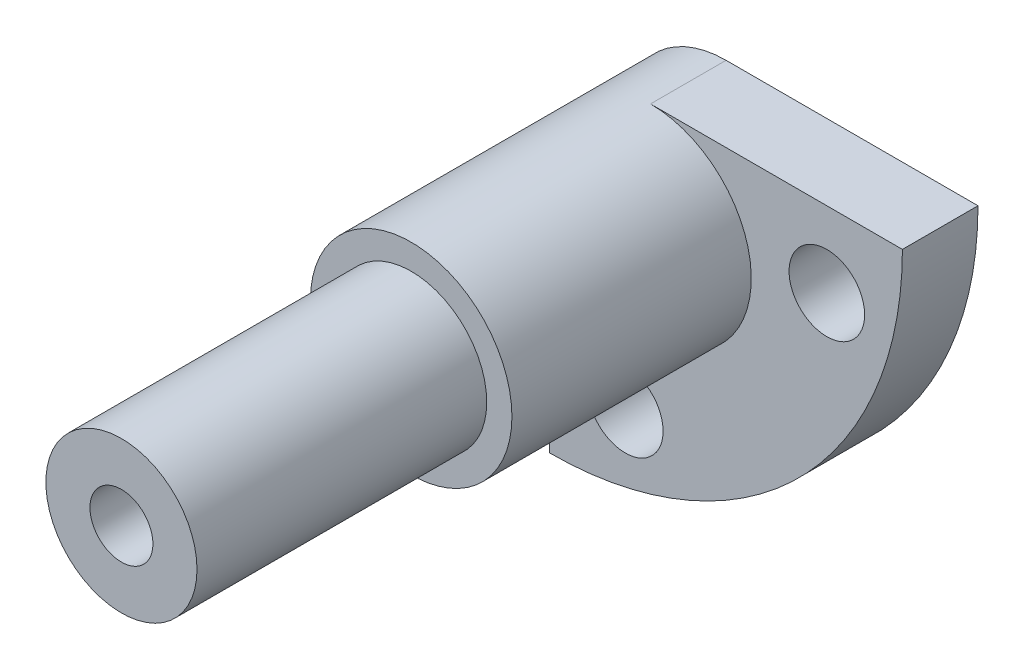
ISO-10303-21;
HEADER;
FILE_DESCRIPTION(('STEP AP214'),'2;1');
FILE_NAME('part.step','',(''),(''),'','','');
FILE_SCHEMA(('AUTOMOTIVE_DESIGN { 1 0 10303 214 1 1 1 1 }'));
ENDSEC;
DATA;
#1=APPLICATION_CONTEXT('core data for automotive mechanical design processes');
#2=APPLICATION_PROTOCOL_DEFINITION('international standard','automotive_design',2000,#1);
#3=PRODUCT_CONTEXT('',#1,'mechanical');
#4=PRODUCT('Part','Part','',(#3));
#5=PRODUCT_RELATED_PRODUCT_CATEGORY('part','',(#4));
#6=PRODUCT_DEFINITION_FORMATION('','',#4);
#7=PRODUCT_DEFINITION_CONTEXT('part definition',#1,'design');
#8=PRODUCT_DEFINITION('design','',#6,#7);
#9=PRODUCT_DEFINITION_SHAPE('','',#8);
#10=(LENGTH_UNIT() NAMED_UNIT(*) SI_UNIT(.MILLI.,.METRE.));
#11=(NAMED_UNIT(*) PLANE_ANGLE_UNIT() SI_UNIT($,.RADIAN.));
#12=(NAMED_UNIT(*) SI_UNIT($,.STERADIAN.) SOLID_ANGLE_UNIT());
#13=UNCERTAINTY_MEASURE_WITH_UNIT(LENGTH_MEASURE(1.E-05),#10,'distance_accuracy_value','');
#14=(GEOMETRIC_REPRESENTATION_CONTEXT(3) GLOBAL_UNCERTAINTY_ASSIGNED_CONTEXT((#13)) GLOBAL_UNIT_ASSIGNED_CONTEXT((#10,
#11,#12)) REPRESENTATION_CONTEXT('',''));
#15=CARTESIAN_POINT('',(0.,0.,0.));
#16=DIRECTION('',(0.,0.,1.));
#17=DIRECTION('',(1.,0.,0.));
#18=AXIS2_PLACEMENT_3D('',#15,#16,#17);
#19=CARTESIAN_POINT('',(0.,0.,12.5));
#20=DIRECTION('',(0.,0.,1.));
#21=DIRECTION('',(1.,0.,0.));
#22=AXIS2_PLACEMENT_3D('',#19,#20,#21);
#23=PLANE('',#22);
#24=CARTESIAN_POINT('',(0.,0.,12.5));
#25=DIRECTION('',(0.,0.,1.));
#26=DIRECTION('',(1.,0.,0.));
#27=AXIS2_PLACEMENT_3D('',#24,#25,#26);
#28=CIRCLE('',#27,4.);
#29=CARTESIAN_POINT('',(4.,0.,12.5));
#30=VERTEX_POINT('',#29);
#31=EDGE_CURVE('E118',#30,#30,#28,.T.);
#32=ORIENTED_EDGE('',*,*,#31,.T.);
#33=EDGE_LOOP('',(#32));
#34=FACE_BOUND('',#33,.T.);
#35=CARTESIAN_POINT('',(0.,0.,12.5));
#36=DIRECTION('',(0.,0.,1.));
#37=DIRECTION('',(1.,0.,0.));
#38=AXIS2_PLACEMENT_3D('',#35,#36,#37);
#39=CIRCLE('',#38,3.);
#40=CARTESIAN_POINT('',(3.,0.,12.5));
#41=VERTEX_POINT('',#40);
#42=EDGE_CURVE('E123',#41,#41,#39,.T.);
#43=ORIENTED_EDGE('',*,*,#42,.F.);
#44=EDGE_LOOP('',(#43));
#45=FACE_BOUND('',#44,.T.);
#46=ADVANCED_FACE('F36',(#34,#45),#23,.T.);
#47=CARTESIAN_POINT('',(0.,0.,3.));
#48=DIRECTION('',(0.,0.,-1.));
#49=DIRECTION('',(-1.,0.,0.));
#50=AXIS2_PLACEMENT_3D('',#47,#48,#49);
#51=CYLINDRICAL_SURFACE('',#50,4.);
#52=CARTESIAN_POINT('',(0.,0.,0.));
#53=DIRECTION('',(0.,0.,1.));
#54=DIRECTION('',(1.,0.,0.));
#55=AXIS2_PLACEMENT_3D('',#52,#53,#54);
#56=CIRCLE('',#55,4.);
#57=CARTESIAN_POINT('',(0.,4.,0.));
#58=VERTEX_POINT('',#57);
#59=CARTESIAN_POINT('',(-4.,0.,0.));
#60=VERTEX_POINT('',#59);
#61=EDGE_CURVE('E97',#58,#60,#56,.T.);
#62=ORIENTED_EDGE('',*,*,#61,.T.);
#63=DIRECTION('',(0.,0.,-1.));
#64=VECTOR('',#63,1.);
#65=CARTESIAN_POINT('',(-4.,0.,3.));
#66=LINE('',#65,#64);
#67=CARTESIAN_POINT('',(-4.,0.,3.));
#68=VERTEX_POINT('',#67);
#69=EDGE_CURVE('E46',#68,#60,#66,.T.);
#70=ORIENTED_EDGE('',*,*,#69,.F.);
#71=CARTESIAN_POINT('',(0.,0.,3.));
#72=DIRECTION('',(0.,0.,1.));
#73=DIRECTION('',(1.,0.,0.));
#74=AXIS2_PLACEMENT_3D('',#71,#72,#73);
#75=CIRCLE('',#74,4.);
#76=CARTESIAN_POINT('',(0.,4.,3.));
#77=VERTEX_POINT('',#76);
#78=EDGE_CURVE('E11',#68,#77,#75,.T.);
#79=ORIENTED_EDGE('',*,*,#78,.T.);
#80=DIRECTION('',(0.,0.,-1.));
#81=VECTOR('',#80,1.);
#82=CARTESIAN_POINT('',(0.,4.,3.));
#83=LINE('',#82,#81);
#84=EDGE_CURVE('E84',#77,#58,#83,.T.);
#85=ORIENTED_EDGE('',*,*,#84,.T.);
#86=EDGE_LOOP('',(#62,#70,#79,#85));
#87=FACE_BOUND('',#86,.T.);
#88=ORIENTED_EDGE('',*,*,#31,.F.);
#89=EDGE_LOOP('',(#88));
#90=FACE_BOUND('',#89,.T.);
#91=ADVANCED_FACE('F38',(#87,#90),#51,.T.);
#92=CARTESIAN_POINT('',(-4.,0.,3.));
#93=DIRECTION('',(1.,0.,0.));
#94=DIRECTION('',(0.,0.,-1.));
#95=AXIS2_PLACEMENT_3D('',#92,#93,#94);
#96=PLANE('',#95);
#97=DIRECTION('',(0.,-1.,0.));
#98=VECTOR('',#97,1.);
#99=CARTESIAN_POINT('',(-4.,0.,0.));
#100=LINE('',#99,#98);
#101=CARTESIAN_POINT('',(-4.,-9.99999999999999,0.));
#102=VERTEX_POINT('',#101);
#103=EDGE_CURVE('E115',#60,#102,#100,.T.);
#104=ORIENTED_EDGE('',*,*,#103,.T.);
#105=DIRECTION('',(0.,0.,-1.));
#106=VECTOR('',#105,1.);
#107=CARTESIAN_POINT('',(-4.,-9.99999999999999,3.));
#108=LINE('',#107,#106);
#109=CARTESIAN_POINT('',(-4.,-9.99999999999999,3.));
#110=VERTEX_POINT('',#109);
#111=EDGE_CURVE('E99',#110,#102,#108,.T.);
#112=ORIENTED_EDGE('',*,*,#111,.F.);
#113=DIRECTION('',(0.,-1.,0.));
#114=VECTOR('',#113,1.);
#115=CARTESIAN_POINT('',(-4.,0.,3.));
#116=LINE('',#115,#114);
#117=EDGE_CURVE('E104',#68,#110,#116,.T.);
#118=ORIENTED_EDGE('',*,*,#117,.F.);
#119=ORIENTED_EDGE('',*,*,#69,.T.);
#120=EDGE_LOOP('',(#104,#112,#118,#119));
#121=FACE_BOUND('',#120,.T.);
#122=ADVANCED_FACE('F175',(#121),#96,.F.);
#123=CARTESIAN_POINT('',(-4.,4.,3.));
#124=DIRECTION('',(0.,0.,-1.));
#125=DIRECTION('',(-1.,0.,0.));
#126=AXIS2_PLACEMENT_3D('',#123,#124,#125);
#127=CYLINDRICAL_SURFACE('',#126,14.);
#128=CARTESIAN_POINT('',(-4.,4.,0.));
#129=DIRECTION('',(0.,0.,1.));
#130=DIRECTION('',(-1.,0.,0.));
#131=AXIS2_PLACEMENT_3D('',#128,#129,#130);
#132=CIRCLE('',#131,14.);
#133=CARTESIAN_POINT('',(9.99999999999999,4.,0.));
#134=VERTEX_POINT('',#133);
#135=EDGE_CURVE('E72',#102,#134,#132,.T.);
#136=ORIENTED_EDGE('',*,*,#135,.T.);
#137=DIRECTION('',(0.,0.,-1.));
#138=VECTOR('',#137,1.);
#139=CARTESIAN_POINT('',(9.99999999999999,4.,3.));
#140=LINE('',#139,#138);
#141=CARTESIAN_POINT('',(9.99999999999999,4.,3.));
#142=VERTEX_POINT('',#141);
#143=EDGE_CURVE('E90',#142,#134,#140,.T.);
#144=ORIENTED_EDGE('',*,*,#143,.F.);
#145=CARTESIAN_POINT('',(-4.,4.,3.));
#146=DIRECTION('',(0.,0.,1.));
#147=DIRECTION('',(-1.,0.,0.));
#148=AXIS2_PLACEMENT_3D('',#145,#146,#147);
#149=CIRCLE('',#148,14.);
#150=EDGE_CURVE('E55',#110,#142,#149,.T.);
#151=ORIENTED_EDGE('',*,*,#150,.F.);
#152=ORIENTED_EDGE('',*,*,#111,.T.);
#153=EDGE_LOOP('',(#136,#144,#151,#152));
#154=FACE_BOUND('',#153,.T.);
#155=ADVANCED_FACE('F186',(#154),#127,.T.);
#156=CARTESIAN_POINT('',(9.99999999999999,4.,3.));
#157=DIRECTION('',(0.,-1.,0.));
#158=DIRECTION('',(0.,0.,-1.));
#159=AXIS2_PLACEMENT_3D('',#156,#157,#158);
#160=PLANE('',#159);
#161=DIRECTION('',(-1.,0.,0.));
#162=VECTOR('',#161,1.);
#163=CARTESIAN_POINT('',(9.99999999999999,4.,0.));
#164=LINE('',#163,#162);
#165=EDGE_CURVE('E78',#134,#58,#164,.T.);
#166=ORIENTED_EDGE('',*,*,#165,.T.);
#167=ORIENTED_EDGE('',*,*,#84,.F.);
#168=DIRECTION('',(-1.,0.,0.));
#169=VECTOR('',#168,1.);
#170=CARTESIAN_POINT('',(9.99999999999999,4.,3.));
#171=LINE('',#170,#169);
#172=EDGE_CURVE('E86',#142,#77,#171,.T.);
#173=ORIENTED_EDGE('',*,*,#172,.F.);
#174=ORIENTED_EDGE('',*,*,#143,.T.);
#175=EDGE_LOOP('',(#166,#167,#173,#174));
#176=FACE_BOUND('',#175,.T.);
#177=ADVANCED_FACE('F85',(#176),#160,.F.);
#178=CARTESIAN_POINT('',(0.,0.,3.));
#179=DIRECTION('',(0.,0.,1.));
#180=DIRECTION('',(1.,0.,0.));
#181=AXIS2_PLACEMENT_3D('',#178,#179,#180);
#182=PLANE('',#181);
#183=CARTESIAN_POINT('',(-1.,-6.99999999999999,3.));
#184=DIRECTION('',(0.,0.,1.));
#185=DIRECTION('',(1.,0.,0.));
#186=AXIS2_PLACEMENT_3D('',#183,#184,#185);
#187=CIRCLE('',#186,1.5);
#188=CARTESIAN_POINT('',(0.499999999999997,-6.99999999999999,3.));
#189=VERTEX_POINT('',#188);
#190=EDGE_CURVE('E143',#189,#189,#187,.T.);
#191=ORIENTED_EDGE('',*,*,#190,.F.);
#192=EDGE_LOOP('',(#191));
#193=FACE_BOUND('',#192,.T.);
#194=CARTESIAN_POINT('',(7.,1.,3.));
#195=DIRECTION('',(0.,0.,1.));
#196=DIRECTION('',(1.,0.,0.));
#197=AXIS2_PLACEMENT_3D('',#194,#195,#196);
#198=CIRCLE('',#197,1.5);
#199=CARTESIAN_POINT('',(8.5,1.,3.));
#200=VERTEX_POINT('',#199);
#201=EDGE_CURVE('E137',#200,#200,#198,.T.);
#202=ORIENTED_EDGE('',*,*,#201,.F.);
#203=EDGE_LOOP('',(#202));
#204=FACE_BOUND('',#203,.T.);
#205=ORIENTED_EDGE('',*,*,#78,.F.);
#206=ORIENTED_EDGE('',*,*,#117,.T.);
#207=ORIENTED_EDGE('',*,*,#150,.T.);
#208=ORIENTED_EDGE('',*,*,#172,.T.);
#209=EDGE_LOOP('',(#205,#206,#207,#208));
#210=FACE_BOUND('',#209,.T.);
#211=ADVANCED_FACE('F92',(#193,#204,#210),#182,.T.);
#212=CARTESIAN_POINT('',(0.,0.,0.));
#213=DIRECTION('',(0.,0.,1.));
#214=DIRECTION('',(1.,0.,0.));
#215=AXIS2_PLACEMENT_3D('',#212,#213,#214);
#216=PLANE('',#215);
#217=CARTESIAN_POINT('',(-1.,-6.99999999999999,0.));
#218=DIRECTION('',(0.,0.,1.));
#219=DIRECTION('',(1.,0.,0.));
#220=AXIS2_PLACEMENT_3D('',#217,#218,#219);
#221=CIRCLE('',#220,1.5);
#222=CARTESIAN_POINT('',(0.499999999999997,-6.99999999999999,0.));
#223=VERTEX_POINT('',#222);
#224=EDGE_CURVE('E140',#223,#223,#221,.F.);
#225=ORIENTED_EDGE('',*,*,#224,.F.);
#226=EDGE_LOOP('',(#225));
#227=FACE_BOUND('',#226,.T.);
#228=CARTESIAN_POINT('',(7.,1.,0.));
#229=DIRECTION('',(0.,0.,1.));
#230=DIRECTION('',(1.,0.,0.));
#231=AXIS2_PLACEMENT_3D('',#228,#229,#230);
#232=CIRCLE('',#231,1.5);
#233=CARTESIAN_POINT('',(8.5,1.,0.));
#234=VERTEX_POINT('',#233);
#235=EDGE_CURVE('E132',#234,#234,#232,.F.);
#236=ORIENTED_EDGE('',*,*,#235,.F.);
#237=EDGE_LOOP('',(#236));
#238=FACE_BOUND('',#237,.T.);
#239=ORIENTED_EDGE('',*,*,#61,.F.);
#240=ORIENTED_EDGE('',*,*,#165,.F.);
#241=ORIENTED_EDGE('',*,*,#135,.F.);
#242=ORIENTED_EDGE('',*,*,#103,.F.);
#243=EDGE_LOOP('',(#239,#240,#241,#242));
#244=FACE_BOUND('',#243,.T.);
#245=ADVANCED_FACE('F151',(#227,#238,#244),#216,.F.);
#246=CARTESIAN_POINT('',(0.,0.,24.));
#247=DIRECTION('',(0.,0.,-1.));
#248=DIRECTION('',(-1.,0.,0.));
#249=AXIS2_PLACEMENT_3D('',#246,#247,#248);
#250=CYLINDRICAL_SURFACE('',#249,3.);
#251=CARTESIAN_POINT('',(0.,0.,24.));
#252=DIRECTION('',(0.,0.,1.));
#253=DIRECTION('',(1.,0.,0.));
#254=AXIS2_PLACEMENT_3D('',#251,#252,#253);
#255=CIRCLE('',#254,3.);
#256=CARTESIAN_POINT('',(3.,0.,24.));
#257=VERTEX_POINT('',#256);
#258=EDGE_CURVE('E122',#257,#257,#255,.T.);
#259=ORIENTED_EDGE('',*,*,#258,.F.);
#260=EDGE_LOOP('',(#259));
#261=FACE_BOUND('',#260,.T.);
#262=ORIENTED_EDGE('',*,*,#42,.T.);
#263=EDGE_LOOP('',(#262));
#264=FACE_BOUND('',#263,.T.);
#265=ADVANCED_FACE('F178',(#261,#264),#250,.T.);
#266=CARTESIAN_POINT('',(0.,0.,24.));
#267=DIRECTION('',(0.,0.,1.));
#268=DIRECTION('',(1.,0.,0.));
#269=AXIS2_PLACEMENT_3D('',#266,#267,#268);
#270=PLANE('',#269);
#271=CARTESIAN_POINT('',(0.,0.,24.));
#272=DIRECTION('',(0.,0.,1.));
#273=DIRECTION('',(1.,0.,0.));
#274=AXIS2_PLACEMENT_3D('',#271,#272,#273);
#275=CIRCLE('',#274,1.25);
#276=CARTESIAN_POINT('',(1.25,0.,24.));
#277=VERTEX_POINT('',#276);
#278=EDGE_CURVE('E129',#277,#277,#275,.T.);
#279=ORIENTED_EDGE('',*,*,#278,.F.);
#280=EDGE_LOOP('',(#279));
#281=FACE_BOUND('',#280,.T.);
#282=ORIENTED_EDGE('',*,*,#258,.T.);
#283=EDGE_LOOP('',(#282));
#284=FACE_BOUND('',#283,.T.);
#285=ADVANCED_FACE('F218',(#281,#284),#270,.T.);
#286=CARTESIAN_POINT('',(0.,0.,14.));
#287=DIRECTION('',(0.,0.,1.));
#288=DIRECTION('',(1.,0.,0.));
#289=AXIS2_PLACEMENT_3D('',#286,#287,#288);
#290=CYLINDRICAL_SURFACE('',#289,1.25);
#291=CARTESIAN_POINT('',(0.,0.,14.));
#292=DIRECTION('',(0.,0.,1.));
#293=DIRECTION('',(1.,0.,0.));
#294=AXIS2_PLACEMENT_3D('',#291,#292,#293);
#295=CIRCLE('',#294,1.25);
#296=CARTESIAN_POINT('',(1.25,0.,14.));
#297=VERTEX_POINT('',#296);
#298=EDGE_CURVE('E126',#297,#297,#295,.T.);
#299=ORIENTED_EDGE('',*,*,#298,.F.);
#300=EDGE_LOOP('',(#299));
#301=FACE_BOUND('',#300,.T.);
#302=ORIENTED_EDGE('',*,*,#278,.T.);
#303=EDGE_LOOP('',(#302));
#304=FACE_BOUND('',#303,.T.);
#305=ADVANCED_FACE('F166',(#301,#304),#290,.F.);
#306=CARTESIAN_POINT('',(0.,0.,14.));
#307=DIRECTION('',(0.,0.,1.));
#308=DIRECTION('',(1.,0.,0.));
#309=AXIS2_PLACEMENT_3D('',#306,#307,#308);
#310=PLANE('',#309);
#311=ORIENTED_EDGE('',*,*,#298,.T.);
#312=EDGE_LOOP('',(#311));
#313=FACE_BOUND('',#312,.T.);
#314=ADVANCED_FACE('F157',(#313),#310,.T.);
#315=CARTESIAN_POINT('',(7.,1.,-4.24264068711929));
#316=DIRECTION('',(0.,0.,1.));
#317=DIRECTION('',(1.,0.,0.));
#318=AXIS2_PLACEMENT_3D('',#315,#316,#317);
#319=CYLINDRICAL_SURFACE('',#318,1.5);
#320=ORIENTED_EDGE('',*,*,#235,.T.);
#321=EDGE_LOOP('',(#320));
#322=FACE_BOUND('',#321,.T.);
#323=ORIENTED_EDGE('',*,*,#201,.T.);
#324=EDGE_LOOP('',(#323));
#325=FACE_BOUND('',#324,.T.);
#326=ADVANCED_FACE('F155',(#322,#325),#319,.F.);
#327=CARTESIAN_POINT('',(-1.,-6.99999999999999,-4.24264068711929));
#328=DIRECTION('',(0.,0.,1.));
#329=DIRECTION('',(1.,0.,0.));
#330=AXIS2_PLACEMENT_3D('',#327,#328,#329);
#331=CYLINDRICAL_SURFACE('',#330,1.5);
#332=ORIENTED_EDGE('',*,*,#224,.T.);
#333=EDGE_LOOP('',(#332));
#334=FACE_BOUND('',#333,.T.);
#335=ORIENTED_EDGE('',*,*,#190,.T.);
#336=EDGE_LOOP('',(#335));
#337=FACE_BOUND('',#336,.T.);
#338=ADVANCED_FACE('F147',(#334,#337),#331,.F.);
#339=CLOSED_SHELL('',(#46,#91,#122,#155,#177,#211,#245,#265,#285,#305,#314,#326,#338));
#340=MANIFOLD_SOLID_BREP('B2',#339);
#341=ADVANCED_BREP_SHAPE_REPRESENTATION('',(#18,#340),#14);
#342=SHAPE_DEFINITION_REPRESENTATION(#9,#341);
ENDSEC;
END-ISO-10303-21;
